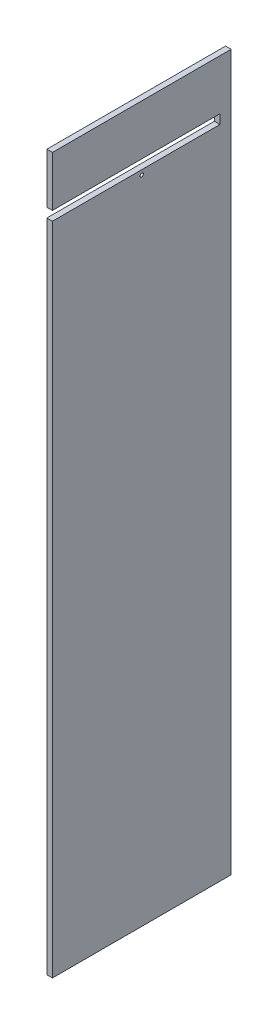
ISO-10303-21;
HEADER;
FILE_DESCRIPTION(('STEP AP214'),'2;1');
FILE_NAME('part.step','',(''),(''),'','','');
FILE_SCHEMA(('AUTOMOTIVE_DESIGN { 1 0 10303 214 1 1 1 1 }'));
ENDSEC;
DATA;
#1=APPLICATION_CONTEXT('core data for automotive mechanical design processes');
#2=APPLICATION_PROTOCOL_DEFINITION('international standard','automotive_design',2000,#1);
#3=PRODUCT_CONTEXT('',#1,'mechanical');
#4=PRODUCT('Part','Part','',(#3));
#5=PRODUCT_RELATED_PRODUCT_CATEGORY('part','',(#4));
#6=PRODUCT_DEFINITION_FORMATION('','',#4);
#7=PRODUCT_DEFINITION_CONTEXT('part definition',#1,'design');
#8=PRODUCT_DEFINITION('design','',#6,#7);
#9=PRODUCT_DEFINITION_SHAPE('','',#8);
#10=(LENGTH_UNIT() NAMED_UNIT(*) SI_UNIT(.MILLI.,.METRE.));
#11=(NAMED_UNIT(*) PLANE_ANGLE_UNIT() SI_UNIT($,.RADIAN.));
#12=(NAMED_UNIT(*) SI_UNIT($,.STERADIAN.) SOLID_ANGLE_UNIT());
#13=UNCERTAINTY_MEASURE_WITH_UNIT(LENGTH_MEASURE(1.E-05),#10,'distance_accuracy_value','');
#14=(GEOMETRIC_REPRESENTATION_CONTEXT(3) GLOBAL_UNCERTAINTY_ASSIGNED_CONTEXT((#13)) GLOBAL_UNIT_ASSIGNED_CONTEXT((#10,
#11,#12)) REPRESENTATION_CONTEXT('',''));
#15=CARTESIAN_POINT('',(0.,0.,0.));
#16=DIRECTION('',(0.,0.,1.));
#17=DIRECTION('',(1.,0.,0.));
#18=AXIS2_PLACEMENT_3D('',#15,#16,#17);
#19=CARTESIAN_POINT('',(4.7625,609.6,0.));
#20=DIRECTION('',(-1.,0.,0.));
#21=DIRECTION('',(0.,0.,1.));
#22=AXIS2_PLACEMENT_3D('',#19,#20,#21);
#23=PLANE('',#22);
#24=DIRECTION('',(0.,-1.,0.));
#25=VECTOR('',#24,1.);
#26=CARTESIAN_POINT('',(4.7625,609.6,0.));
#27=LINE('',#26,#25);
#28=CARTESIAN_POINT('',(4.7625,609.6,0.));
#29=VERTEX_POINT('',#28);
#30=CARTESIAN_POINT('',(4.7625,566.7375,0.));
#31=VERTEX_POINT('',#30);
#32=EDGE_CURVE('E129',#29,#31,#27,.T.);
#33=ORIENTED_EDGE('',*,*,#32,.T.);
#34=DIRECTION('',(0.,0.,1.));
#35=VECTOR('',#34,1.);
#36=CARTESIAN_POINT('',(4.7625,566.7375,0.));
#37=LINE('',#36,#35);
#38=CARTESIAN_POINT('',(4.7625,566.7375,-142.875));
#39=VERTEX_POINT('',#38);
#40=EDGE_CURVE('E116',#39,#31,#37,.T.);
#41=ORIENTED_EDGE('',*,*,#40,.F.);
#42=DIRECTION('',(0.,1.,0.));
#43=VECTOR('',#42,1.);
#44=CARTESIAN_POINT('',(4.7625,558.8,-142.875));
#45=LINE('',#44,#43);
#46=CARTESIAN_POINT('',(4.7625,558.8,-142.875));
#47=VERTEX_POINT('',#46);
#48=EDGE_CURVE('E158',#47,#39,#45,.T.);
#49=ORIENTED_EDGE('',*,*,#48,.F.);
#50=DIRECTION('',(0.,0.,-1.));
#51=VECTOR('',#50,1.);
#52=CARTESIAN_POINT('',(4.7625,558.8,-1.11022302462516E-13));
#53=LINE('',#52,#51);
#54=CARTESIAN_POINT('',(4.7625,558.8,0.));
#55=VERTEX_POINT('',#54);
#56=EDGE_CURVE('E161',#55,#47,#53,.T.);
#57=ORIENTED_EDGE('',*,*,#56,.F.);
#58=CARTESIAN_POINT('',(4.7625,0.,0.));
#59=VERTEX_POINT('',#58);
#60=EDGE_CURVE('E123',#55,#59,#27,.T.);
#61=ORIENTED_EDGE('',*,*,#60,.T.);
#62=DIRECTION('',(0.,0.,-1.));
#63=VECTOR('',#62,1.);
#64=CARTESIAN_POINT('',(4.7625,0.,0.));
#65=LINE('',#64,#63);
#66=CARTESIAN_POINT('',(4.7625,0.,-152.4));
#67=VERTEX_POINT('',#66);
#68=EDGE_CURVE('E141',#59,#67,#65,.T.);
#69=ORIENTED_EDGE('',*,*,#68,.T.);
#70=DIRECTION('',(0.,-1.,0.));
#71=VECTOR('',#70,1.);
#72=CARTESIAN_POINT('',(4.7625,609.6,-152.4));
#73=LINE('',#72,#71);
#74=CARTESIAN_POINT('',(4.7625,609.6,-152.4));
#75=VERTEX_POINT('',#74);
#76=EDGE_CURVE('E134',#75,#67,#73,.T.);
#77=ORIENTED_EDGE('',*,*,#76,.F.);
#78=DIRECTION('',(0.,0.,-1.));
#79=VECTOR('',#78,1.);
#80=CARTESIAN_POINT('',(4.7625,609.6,0.));
#81=LINE('',#80,#79);
#82=EDGE_CURVE('E148',#29,#75,#81,.T.);
#83=ORIENTED_EDGE('',*,*,#82,.F.);
#84=EDGE_LOOP('',(#33,#41,#49,#57,#61,#69,#77,#83));
#85=FACE_BOUND('',#84,.T.);
#86=CARTESIAN_POINT('',(4.7625,554.83125,-76.2000000000001));
#87=DIRECTION('',(1.,0.,0.));
#88=DIRECTION('',(0.,0.,-1.));
#89=AXIS2_PLACEMENT_3D('',#86,#87,#88);
#90=CIRCLE('',#89,1.47319999999995);
#91=CARTESIAN_POINT('',(4.7625,554.83125,-77.6732));
#92=VERTEX_POINT('',#91);
#93=EDGE_CURVE('E169',#92,#92,#90,.T.);
#94=ORIENTED_EDGE('',*,*,#93,.F.);
#95=EDGE_LOOP('',(#94));
#96=FACE_BOUND('',#95,.T.);
#97=ADVANCED_FACE('F35',(#85,#96),#23,.F.);
#98=CARTESIAN_POINT('',(0.,609.6,0.));
#99=DIRECTION('',(0.,0.,-1.));
#100=DIRECTION('',(-1.,0.,0.));
#101=AXIS2_PLACEMENT_3D('',#98,#99,#100);
#102=PLANE('',#101);
#103=DIRECTION('',(0.,-1.,0.));
#104=VECTOR('',#103,1.);
#105=CARTESIAN_POINT('',(0.,609.6,0.));
#106=LINE('',#105,#104);
#107=CARTESIAN_POINT('',(0.,609.6,0.));
#108=VERTEX_POINT('',#107);
#109=CARTESIAN_POINT('',(0.,566.7375,0.));
#110=VERTEX_POINT('',#109);
#111=EDGE_CURVE('E11',#108,#110,#106,.T.);
#112=ORIENTED_EDGE('',*,*,#111,.T.);
#113=DIRECTION('',(1.,0.,0.));
#114=VECTOR('',#113,1.);
#115=CARTESIAN_POINT('',(0.,566.7375,0.));
#116=LINE('',#115,#114);
#117=EDGE_CURVE('E146',#110,#31,#116,.T.);
#118=ORIENTED_EDGE('',*,*,#117,.T.);
#119=ORIENTED_EDGE('',*,*,#32,.F.);
#120=DIRECTION('',(1.,0.,0.));
#121=VECTOR('',#120,1.);
#122=CARTESIAN_POINT('',(0.,609.6,0.));
#123=LINE('',#122,#121);
#124=EDGE_CURVE('E87',#108,#29,#123,.T.);
#125=ORIENTED_EDGE('',*,*,#124,.F.);
#126=EDGE_LOOP('',(#112,#118,#119,#125));
#127=FACE_BOUND('',#126,.T.);
#128=ADVANCED_FACE('F176',(#127),#102,.F.);
#129=CARTESIAN_POINT('',(0.,609.6,0.));
#130=DIRECTION('',(1.,0.,0.));
#131=DIRECTION('',(0.,0.,-1.));
#132=AXIS2_PLACEMENT_3D('',#129,#130,#131);
#133=PLANE('',#132);
#134=CARTESIAN_POINT('',(0.,554.83125,-76.2000000000001));
#135=DIRECTION('',(1.,0.,0.));
#136=DIRECTION('',(0.,0.,-1.));
#137=AXIS2_PLACEMENT_3D('',#134,#135,#136);
#138=CIRCLE('',#137,1.47319999999995);
#139=CARTESIAN_POINT('',(0.,554.83125,-77.6732));
#140=VERTEX_POINT('',#139);
#141=EDGE_CURVE('E163',#140,#140,#138,.T.);
#142=ORIENTED_EDGE('',*,*,#141,.T.);
#143=EDGE_LOOP('',(#142));
#144=FACE_BOUND('',#143,.T.);
#145=DIRECTION('',(0.,1.,0.));
#146=VECTOR('',#145,1.);
#147=CARTESIAN_POINT('',(0.,558.8,-142.875));
#148=LINE('',#147,#146);
#149=CARTESIAN_POINT('',(0.,558.8,-142.875));
#150=VERTEX_POINT('',#149);
#151=CARTESIAN_POINT('',(0.,566.7375,-142.875));
#152=VERTEX_POINT('',#151);
#153=EDGE_CURVE('E115',#150,#152,#148,.T.);
#154=ORIENTED_EDGE('',*,*,#153,.T.);
#155=DIRECTION('',(0.,0.,1.));
#156=VECTOR('',#155,1.);
#157=CARTESIAN_POINT('',(0.,566.7375,0.));
#158=LINE('',#157,#156);
#159=EDGE_CURVE('E124',#152,#110,#158,.T.);
#160=ORIENTED_EDGE('',*,*,#159,.T.);
#161=ORIENTED_EDGE('',*,*,#111,.F.);
#162=DIRECTION('',(0.,0.,1.));
#163=VECTOR('',#162,1.);
#164=CARTESIAN_POINT('',(0.,609.6,0.));
#165=LINE('',#164,#163);
#166=CARTESIAN_POINT('',(0.,609.6,-152.4));
#167=VERTEX_POINT('',#166);
#168=EDGE_CURVE('E140',#167,#108,#165,.T.);
#169=ORIENTED_EDGE('',*,*,#168,.F.);
#170=DIRECTION('',(0.,-1.,0.));
#171=VECTOR('',#170,1.);
#172=CARTESIAN_POINT('',(0.,609.6,-152.4));
#173=LINE('',#172,#171);
#174=CARTESIAN_POINT('',(0.,0.,-152.4));
#175=VERTEX_POINT('',#174);
#176=EDGE_CURVE('E137',#167,#175,#173,.T.);
#177=ORIENTED_EDGE('',*,*,#176,.T.);
#178=DIRECTION('',(0.,0.,1.));
#179=VECTOR('',#178,1.);
#180=CARTESIAN_POINT('',(0.,0.,0.));
#181=LINE('',#180,#179);
#182=CARTESIAN_POINT('',(0.,0.,0.));
#183=VERTEX_POINT('',#182);
#184=EDGE_CURVE('E128',#175,#183,#181,.T.);
#185=ORIENTED_EDGE('',*,*,#184,.T.);
#186=CARTESIAN_POINT('',(0.,558.8,-1.11022302462516E-13));
#187=VERTEX_POINT('',#186);
#188=EDGE_CURVE('E43',#187,#183,#106,.T.);
#189=ORIENTED_EDGE('',*,*,#188,.F.);
#190=DIRECTION('',(0.,0.,-1.));
#191=VECTOR('',#190,1.);
#192=CARTESIAN_POINT('',(0.,558.8,-1.11022302462516E-13));
#193=LINE('',#192,#191);
#194=EDGE_CURVE('E108',#187,#150,#193,.T.);
#195=ORIENTED_EDGE('',*,*,#194,.T.);
#196=EDGE_LOOP('',(#154,#160,#161,#169,#177,#185,#189,#195));
#197=FACE_BOUND('',#196,.T.);
#198=ADVANCED_FACE('F37',(#144,#197),#133,.F.);
#199=ORIENTED_EDGE('',*,*,#60,.F.);
#200=DIRECTION('',(1.,0.,0.));
#201=VECTOR('',#200,1.);
#202=CARTESIAN_POINT('',(0.,558.8,-1.11022302462516E-13));
#203=LINE('',#202,#201);
#204=EDGE_CURVE('E50',#187,#55,#203,.T.);
#205=ORIENTED_EDGE('',*,*,#204,.F.);
#206=ORIENTED_EDGE('',*,*,#188,.T.);
#207=DIRECTION('',(1.,0.,0.));
#208=VECTOR('',#207,1.);
#209=CARTESIAN_POINT('',(0.,0.,0.));
#210=LINE('',#209,#208);
#211=EDGE_CURVE('E143',#183,#59,#210,.T.);
#212=ORIENTED_EDGE('',*,*,#211,.T.);
#213=EDGE_LOOP('',(#199,#205,#206,#212));
#214=FACE_BOUND('',#213,.T.);
#215=ADVANCED_FACE('F120',(#214),#102,.F.);
#216=CARTESIAN_POINT('',(0.,609.6,-152.4));
#217=DIRECTION('',(0.,0.,1.));
#218=DIRECTION('',(1.,0.,0.));
#219=AXIS2_PLACEMENT_3D('',#216,#217,#218);
#220=PLANE('',#219);
#221=DIRECTION('',(-1.,0.,0.));
#222=VECTOR('',#221,1.);
#223=CARTESIAN_POINT('',(0.,0.,-152.4));
#224=LINE('',#223,#222);
#225=EDGE_CURVE('E80',#67,#175,#224,.T.);
#226=ORIENTED_EDGE('',*,*,#225,.T.);
#227=ORIENTED_EDGE('',*,*,#176,.F.);
#228=DIRECTION('',(-1.,0.,0.));
#229=VECTOR('',#228,1.);
#230=CARTESIAN_POINT('',(0.,609.6,-152.4));
#231=LINE('',#230,#229);
#232=EDGE_CURVE('E59',#75,#167,#231,.T.);
#233=ORIENTED_EDGE('',*,*,#232,.F.);
#234=ORIENTED_EDGE('',*,*,#76,.T.);
#235=EDGE_LOOP('',(#226,#227,#233,#234));
#236=FACE_BOUND('',#235,.T.);
#237=ADVANCED_FACE('F182',(#236),#220,.F.);
#238=CARTESIAN_POINT('',(0.,609.6,0.));
#239=DIRECTION('',(0.,-1.,0.));
#240=DIRECTION('',(0.,0.,-1.));
#241=AXIS2_PLACEMENT_3D('',#238,#239,#240);
#242=PLANE('',#241);
#243=ORIENTED_EDGE('',*,*,#168,.T.);
#244=ORIENTED_EDGE('',*,*,#124,.T.);
#245=ORIENTED_EDGE('',*,*,#82,.T.);
#246=ORIENTED_EDGE('',*,*,#232,.T.);
#247=EDGE_LOOP('',(#243,#244,#245,#246));
#248=FACE_BOUND('',#247,.T.);
#249=ADVANCED_FACE('F189',(#248),#242,.F.);
#250=CARTESIAN_POINT('',(0.,0.,0.));
#251=DIRECTION('',(0.,-1.,0.));
#252=DIRECTION('',(0.,0.,-1.));
#253=AXIS2_PLACEMENT_3D('',#250,#251,#252);
#254=PLANE('',#253);
#255=ORIENTED_EDGE('',*,*,#184,.F.);
#256=ORIENTED_EDGE('',*,*,#225,.F.);
#257=ORIENTED_EDGE('',*,*,#68,.F.);
#258=ORIENTED_EDGE('',*,*,#211,.F.);
#259=EDGE_LOOP('',(#255,#256,#257,#258));
#260=FACE_BOUND('',#259,.T.);
#261=ADVANCED_FACE('F206',(#260),#254,.T.);
#262=CARTESIAN_POINT('',(0.,566.7375,0.));
#263=DIRECTION('',(0.,1.,0.));
#264=DIRECTION('',(0.,0.,1.));
#265=AXIS2_PLACEMENT_3D('',#262,#263,#264);
#266=PLANE('',#265);
#267=ORIENTED_EDGE('',*,*,#40,.T.);
#268=ORIENTED_EDGE('',*,*,#117,.F.);
#269=ORIENTED_EDGE('',*,*,#159,.F.);
#270=DIRECTION('',(1.,0.,0.));
#271=VECTOR('',#270,1.);
#272=CARTESIAN_POINT('',(0.,566.7375,-142.875));
#273=LINE('',#272,#271);
#274=EDGE_CURVE('E153',#152,#39,#273,.T.);
#275=ORIENTED_EDGE('',*,*,#274,.T.);
#276=EDGE_LOOP('',(#267,#268,#269,#275));
#277=FACE_BOUND('',#276,.T.);
#278=ADVANCED_FACE('F203',(#277),#266,.F.);
#279=CARTESIAN_POINT('',(0.,558.8,-142.875));
#280=DIRECTION('',(0.,0.,-1.));
#281=DIRECTION('',(-1.,0.,0.));
#282=AXIS2_PLACEMENT_3D('',#279,#280,#281);
#283=PLANE('',#282);
#284=ORIENTED_EDGE('',*,*,#48,.T.);
#285=ORIENTED_EDGE('',*,*,#274,.F.);
#286=ORIENTED_EDGE('',*,*,#153,.F.);
#287=DIRECTION('',(1.,0.,0.));
#288=VECTOR('',#287,1.);
#289=CARTESIAN_POINT('',(0.,558.8,-142.875));
#290=LINE('',#289,#288);
#291=EDGE_CURVE('E110',#150,#47,#290,.T.);
#292=ORIENTED_EDGE('',*,*,#291,.T.);
#293=EDGE_LOOP('',(#284,#285,#286,#292));
#294=FACE_BOUND('',#293,.T.);
#295=ADVANCED_FACE('F200',(#294),#283,.F.);
#296=CARTESIAN_POINT('',(0.,558.8,-1.11022302462516E-13));
#297=DIRECTION('',(0.,-1.,0.));
#298=DIRECTION('',(0.,0.,-1.));
#299=AXIS2_PLACEMENT_3D('',#296,#297,#298);
#300=PLANE('',#299);
#301=ORIENTED_EDGE('',*,*,#56,.T.);
#302=ORIENTED_EDGE('',*,*,#291,.F.);
#303=ORIENTED_EDGE('',*,*,#194,.F.);
#304=ORIENTED_EDGE('',*,*,#204,.T.);
#305=EDGE_LOOP('',(#301,#302,#303,#304));
#306=FACE_BOUND('',#305,.T.);
#307=ADVANCED_FACE('F109',(#306),#300,.F.);
#308=CARTESIAN_POINT('',(4.7625,554.83125,-76.2000000000001));
#309=DIRECTION('',(1.,0.,0.));
#310=DIRECTION('',(0.,0.,-1.));
#311=AXIS2_PLACEMENT_3D('',#308,#309,#310);
#312=CYLINDRICAL_SURFACE('',#311,1.47319999999995);
#313=ORIENTED_EDGE('',*,*,#141,.F.);
#314=EDGE_LOOP('',(#313));
#315=FACE_BOUND('',#314,.T.);
#316=ORIENTED_EDGE('',*,*,#93,.T.);
#317=EDGE_LOOP('',(#316));
#318=FACE_BOUND('',#317,.T.);
#319=ADVANCED_FACE('F173',(#315,#318),#312,.F.);
#320=CLOSED_SHELL('',(#97,#128,#198,#215,#237,#249,#261,#278,#295,#307,#319));
#321=MANIFOLD_SOLID_BREP('B2',#320);
#322=ADVANCED_BREP_SHAPE_REPRESENTATION('',(#18,#321),#14);
#323=SHAPE_DEFINITION_REPRESENTATION(#9,#322);
ENDSEC;
END-ISO-10303-21;
